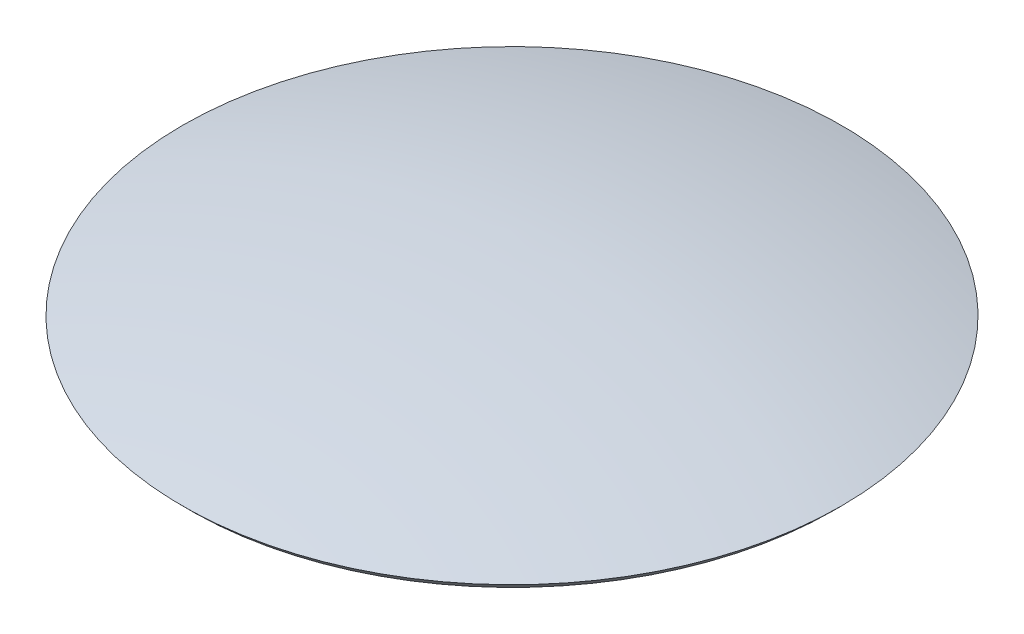
ISO-10303-21;
HEADER;
FILE_DESCRIPTION(('STEP AP214'),'2;1');
FILE_NAME('part.step','',(''),(''),'','','');
FILE_SCHEMA(('AUTOMOTIVE_DESIGN { 1 0 10303 214 1 1 1 1 }'));
ENDSEC;
DATA;
#1=APPLICATION_CONTEXT('core data for automotive mechanical design processes');
#2=APPLICATION_PROTOCOL_DEFINITION('international standard','automotive_design',2000,#1);
#3=PRODUCT_CONTEXT('',#1,'mechanical');
#4=PRODUCT('Part','Part','',(#3));
#5=PRODUCT_RELATED_PRODUCT_CATEGORY('part','',(#4));
#6=PRODUCT_DEFINITION_FORMATION('','',#4);
#7=PRODUCT_DEFINITION_CONTEXT('part definition',#1,'design');
#8=PRODUCT_DEFINITION('design','',#6,#7);
#9=PRODUCT_DEFINITION_SHAPE('','',#8);
#10=(LENGTH_UNIT() NAMED_UNIT(*) SI_UNIT(.MILLI.,.METRE.));
#11=(NAMED_UNIT(*) PLANE_ANGLE_UNIT() SI_UNIT($,.RADIAN.));
#12=(NAMED_UNIT(*) SI_UNIT($,.STERADIAN.) SOLID_ANGLE_UNIT());
#13=UNCERTAINTY_MEASURE_WITH_UNIT(LENGTH_MEASURE(1.E-05),#10,'distance_accuracy_value','');
#14=(GEOMETRIC_REPRESENTATION_CONTEXT(3) GLOBAL_UNCERTAINTY_ASSIGNED_CONTEXT((#13)) GLOBAL_UNIT_ASSIGNED_CONTEXT((#10,
#11,#12)) REPRESENTATION_CONTEXT('',''));
#15=CARTESIAN_POINT('',(0.,0.,0.));
#16=DIRECTION('',(0.,0.,1.));
#17=DIRECTION('',(1.,0.,0.));
#18=AXIS2_PLACEMENT_3D('',#15,#16,#17);
#19=CARTESIAN_POINT('',(0.,-32.5833333333333,0.));
#20=DIRECTION('',(0.,1.,0.));
#21=DIRECTION('',(-1.,0.,0.));
#22=AXIS2_PLACEMENT_3D('',#19,#20,#21);
#23=SPHERICAL_SURFACE('',#22,34.0833333333333);
#24=CARTESIAN_POINT('',(0.,0.227215386805583,0.));
#25=DIRECTION('',(0.,-1.,0.));
#26=DIRECTION('',(1.,0.,0.));
#27=AXIS2_PLACEMENT_3D('',#24,#25,#26);
#28=CIRCLE('',#27,9.22721538680558);
#29=CARTESIAN_POINT('',(9.22721538680559,0.227215386805583,0.));
#30=VERTEX_POINT('',#29);
#31=EDGE_CURVE('E55',#30,#30,#28,.F.);
#32=ORIENTED_EDGE('',*,*,#31,.T.);
#33=EDGE_LOOP('',(#32));
#34=FACE_BOUND('',#33,.T.);
#35=ADVANCED_FACE('F47',(#34),#23,.T.);
#36=CARTESIAN_POINT('',(0.,0.,0.));
#37=DIRECTION('',(0.,-1.,0.));
#38=DIRECTION('',(1.,0.,0.));
#39=AXIS2_PLACEMENT_3D('',#36,#37,#38);
#40=PLANE('',#39);
#41=CARTESIAN_POINT('',(0.,0.,0.));
#42=DIRECTION('',(0.,-1.,0.));
#43=DIRECTION('',(1.,0.,0.));
#44=AXIS2_PLACEMENT_3D('',#41,#42,#43);
#45=CIRCLE('',#44,8.99999999999998);
#46=CARTESIAN_POINT('',(8.99999999999999,0.,0.));
#47=VERTEX_POINT('',#46);
#48=EDGE_CURVE('E11',#47,#47,#45,.T.);
#49=ORIENTED_EDGE('',*,*,#48,.T.);
#50=EDGE_LOOP('',(#49));
#51=FACE_BOUND('',#50,.T.);
#52=ADVANCED_FACE('F63',(#51),#40,.T.);
#53=CARTESIAN_POINT('',(0.,0.227215386805583,0.));
#54=DIRECTION('',(0.,1.,0.));
#55=DIRECTION('',(-1.,0.,0.));
#56=AXIS2_PLACEMENT_3D('',#53,#54,#55);
#57=CONICAL_SURFACE('',#56,9.22721538680558,0.785398163397486);
#58=ORIENTED_EDGE('',*,*,#48,.F.);
#59=EDGE_LOOP('',(#58));
#60=FACE_BOUND('',#59,.T.);
#61=ORIENTED_EDGE('',*,*,#31,.F.);
#62=EDGE_LOOP('',(#61));
#63=FACE_BOUND('',#62,.T.);
#64=ADVANCED_FACE('F50',(#60,#63),#57,.T.);
#65=CLOSED_SHELL('',(#35,#52,#64));
#66=MANIFOLD_SOLID_BREP('B2',#65);
#67=ADVANCED_BREP_SHAPE_REPRESENTATION('',(#18,#66),#14);
#68=SHAPE_DEFINITION_REPRESENTATION(#9,#67);
ENDSEC;
END-ISO-10303-21;
